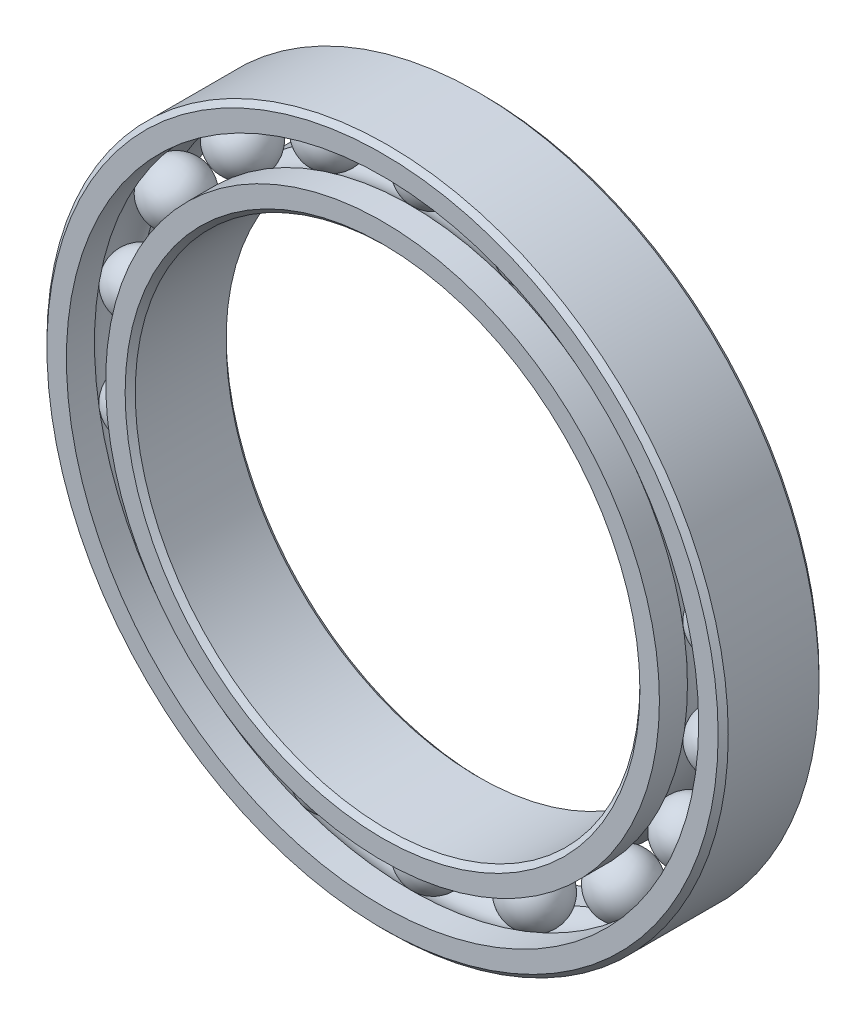
ISO-10303-21;
HEADER;
FILE_DESCRIPTION(('STEP AP214'),'2;1');
FILE_NAME('part.step','',(''),(''),'','','');
FILE_SCHEMA(('AUTOMOTIVE_DESIGN { 1 0 10303 214 1 1 1 1 }'));
ENDSEC;
DATA;
#1=APPLICATION_CONTEXT('core data for automotive mechanical design processes');
#2=APPLICATION_PROTOCOL_DEFINITION('international standard','automotive_design',2000,#1);
#3=PRODUCT_CONTEXT('',#1,'mechanical');
#4=PRODUCT('Part','Part','',(#3));
#5=PRODUCT_RELATED_PRODUCT_CATEGORY('part','',(#4));
#6=PRODUCT_DEFINITION_FORMATION('','',#4);
#7=PRODUCT_DEFINITION_CONTEXT('part definition',#1,'design');
#8=PRODUCT_DEFINITION('design','',#6,#7);
#9=PRODUCT_DEFINITION_SHAPE('','',#8);
#10=(LENGTH_UNIT() NAMED_UNIT(*) SI_UNIT(.MILLI.,.METRE.));
#11=(NAMED_UNIT(*) PLANE_ANGLE_UNIT() SI_UNIT($,.RADIAN.));
#12=(NAMED_UNIT(*) SI_UNIT($,.STERADIAN.) SOLID_ANGLE_UNIT());
#13=UNCERTAINTY_MEASURE_WITH_UNIT(LENGTH_MEASURE(1.E-05),#10,'distance_accuracy_value','');
#14=(GEOMETRIC_REPRESENTATION_CONTEXT(3) GLOBAL_UNCERTAINTY_ASSIGNED_CONTEXT((#13)) GLOBAL_UNIT_ASSIGNED_CONTEXT((#10,
#11,#12)) REPRESENTATION_CONTEXT('',''));
#15=CARTESIAN_POINT('',(0.,0.,0.));
#16=DIRECTION('',(0.,0.,1.));
#17=DIRECTION('',(1.,0.,0.));
#18=AXIS2_PLACEMENT_3D('',#15,#16,#17);
#19=CARTESIAN_POINT('',(4.01873668407647,11.0413882942345,0.));
#20=DIRECTION('',(0.,0.,1.));
#21=DIRECTION('',(0.342020143325657,0.939692620785913,0.));
#22=AXIS2_PLACEMENT_3D('',#19,#20,#21);
#23=SPHERICAL_SURFACE('',#22,1.18112731252607);
#24=CARTESIAN_POINT('',(4.01873668407647,11.0413882942345,1.18112731252607));
#25=VERTEX_POINT('',#24);
#26=VERTEX_LOOP('',#25);
#27=FACE_BOUND('',#26,.T.);
#28=ADVANCED_FACE('F37',(#27),#23,.T.);
#29=CLOSED_SHELL('',(#28));
#30=MANIFOLD_SOLID_BREP('B2',#29);
#31=CARTESIAN_POINT('',(7.55275441381673,9.00102220664808,0.));
#32=DIRECTION('',(0.,0.,1.));
#33=DIRECTION('',(0.64278760968653,0.766044443118986,0.));
#34=AXIS2_PLACEMENT_3D('',#31,#32,#33);
#35=SPHERICAL_SURFACE('',#34,1.18112731252607);
#36=CARTESIAN_POINT('',(7.55275441381673,9.00102220664808,1.18112731252607));
#37=VERTEX_POINT('',#36);
#38=VERTEX_LOOP('',#37);
#39=FACE_BOUND('',#38,.T.);
#40=ADVANCED_FACE('F57',(#39),#35,.T.);
#41=CLOSED_SHELL('',(#40));
#42=MANIFOLD_SOLID_BREP('B6',#41);
#43=CARTESIAN_POINT('',(10.1757984944671,5.87500000000012,0.));
#44=DIRECTION('',(0.,0.,1.));
#45=DIRECTION('',(0.866025403784433,0.50000000000001,0.));
#46=AXIS2_PLACEMENT_3D('',#43,#44,#45);
#47=SPHERICAL_SURFACE('',#46,1.18112731252607);
#48=CARTESIAN_POINT('',(10.1757984944671,5.87500000000012,1.18112731252607));
#49=VERTEX_POINT('',#48);
#50=VERTEX_LOOP('',#49);
#51=FACE_BOUND('',#50,.T.);
#52=ADVANCED_FACE('F77',(#51),#47,.T.);
#53=CLOSED_SHELL('',(#52));
#54=MANIFOLD_SOLID_BREP('B33',#53);
#55=CARTESIAN_POINT('',(11.5714910978934,2.04036608758655,0.));
#56=DIRECTION('',(0.,0.,1.));
#57=DIRECTION('',(0.984807753012206,0.17364817766694,0.));
#58=AXIS2_PLACEMENT_3D('',#55,#56,#57);
#59=SPHERICAL_SURFACE('',#58,1.18112731252607);
#60=CARTESIAN_POINT('',(11.5714910978934,2.04036608758655,1.18112731252607));
#61=VERTEX_POINT('',#60);
#62=VERTEX_LOOP('',#61);
#63=FACE_BOUND('',#62,.T.);
#64=ADVANCED_FACE('F97',(#63),#59,.T.);
#65=CLOSED_SHELL('',(#64));
#66=MANIFOLD_SOLID_BREP('B53',#65);
#67=CARTESIAN_POINT('',(11.5714910978935,-2.04036608758632,0.));
#68=DIRECTION('',(0.,0.,1.));
#69=DIRECTION('',(0.98480775301221,-0.173648177666921,0.));
#70=AXIS2_PLACEMENT_3D('',#67,#68,#69);
#71=SPHERICAL_SURFACE('',#70,1.18112731252607);
#72=CARTESIAN_POINT('',(11.5714910978935,-2.04036608758632,1.18112731252607));
#73=VERTEX_POINT('',#72);
#74=VERTEX_LOOP('',#73);
#75=FACE_BOUND('',#74,.T.);
#76=ADVANCED_FACE('F117',(#75),#71,.T.);
#77=CLOSED_SHELL('',(#76));
#78=MANIFOLD_SOLID_BREP('B73',#77);
#79=CARTESIAN_POINT('',(10.1757984944672,-5.87499999999991,0.));
#80=DIRECTION('',(0.,0.,1.));
#81=DIRECTION('',(0.866025403784443,-0.499999999999992,0.));
#82=AXIS2_PLACEMENT_3D('',#79,#80,#81);
#83=SPHERICAL_SURFACE('',#82,1.18112731252607);
#84=CARTESIAN_POINT('',(10.1757984944672,-5.87499999999991,1.18112731252607));
#85=VERTEX_POINT('',#84);
#86=VERTEX_LOOP('',#85);
#87=FACE_BOUND('',#86,.T.);
#88=ADVANCED_FACE('F137',(#87),#83,.T.);
#89=CLOSED_SHELL('',(#88));
#90=MANIFOLD_SOLID_BREP('B93',#89);
#91=CARTESIAN_POINT('',(7.55275441381691,-9.00102220664793,0.));
#92=DIRECTION('',(0.,0.,1.));
#93=DIRECTION('',(0.642787609686546,-0.766044443118973,0.));
#94=AXIS2_PLACEMENT_3D('',#91,#92,#93);
#95=SPHERICAL_SURFACE('',#94,1.18112731252607);
#96=CARTESIAN_POINT('',(7.55275441381691,-9.00102220664793,1.18112731252607));
#97=VERTEX_POINT('',#96);
#98=VERTEX_LOOP('',#97);
#99=FACE_BOUND('',#98,.T.);
#100=ADVANCED_FACE('F157',(#99),#95,.T.);
#101=CLOSED_SHELL('',(#100));
#102=MANIFOLD_SOLID_BREP('B113',#101);
#103=CARTESIAN_POINT('',(4.01873668407669,-11.0413882942344,0.));
#104=DIRECTION('',(0.,0.,1.));
#105=DIRECTION('',(0.342020143325676,-0.939692620785906,0.));
#106=AXIS2_PLACEMENT_3D('',#103,#104,#105);
#107=SPHERICAL_SURFACE('',#106,1.18112731252607);
#108=CARTESIAN_POINT('',(4.01873668407669,-11.0413882942344,1.18112731252607));
#109=VERTEX_POINT('',#108);
#110=VERTEX_LOOP('',#109);
#111=FACE_BOUND('',#110,.T.);
#112=ADVANCED_FACE('F177',(#111),#107,.T.);
#113=CLOSED_SHELL('',(#112));
#114=MANIFOLD_SOLID_BREP('B133',#113);
#115=CARTESIAN_POINT('',(0.,-11.75,0.));
#116=DIRECTION('',(0.,0.,1.));
#117=DIRECTION('',(0.,-1.,0.));
#118=AXIS2_PLACEMENT_3D('',#115,#116,#117);
#119=SPHERICAL_SURFACE('',#118,1.18112731252607);
#120=CARTESIAN_POINT('',(0.,-11.75,1.18112731252607));
#121=VERTEX_POINT('',#120);
#122=VERTEX_LOOP('',#121);
#123=FACE_BOUND('',#122,.T.);
#124=ADVANCED_FACE('F197',(#123),#119,.T.);
#125=CLOSED_SHELL('',(#124));
#126=MANIFOLD_SOLID_BREP('B153',#125);
#127=CARTESIAN_POINT('',(-4.01873668407654,-11.0413882942344,0.));
#128=DIRECTION('',(0.,0.,1.));
#129=DIRECTION('',(-0.342020143325663,-0.939692620785911,0.));
#130=AXIS2_PLACEMENT_3D('',#127,#128,#129);
#131=SPHERICAL_SURFACE('',#130,1.18112731252607);
#132=CARTESIAN_POINT('',(-4.01873668407654,-11.0413882942344,1.18112731252607));
#133=VERTEX_POINT('',#132);
#134=VERTEX_LOOP('',#133);
#135=FACE_BOUND('',#134,.T.);
#136=ADVANCED_FACE('F217',(#135),#131,.T.);
#137=CLOSED_SHELL('',(#136));
#138=MANIFOLD_SOLID_BREP('B173',#137);
#139=CARTESIAN_POINT('',(-7.55275441381679,-9.00102220664803,0.));
#140=DIRECTION('',(0.,0.,1.));
#141=DIRECTION('',(-0.642787609686535,-0.766044443118981,0.));
#142=AXIS2_PLACEMENT_3D('',#139,#140,#141);
#143=SPHERICAL_SURFACE('',#142,1.18112731252607);
#144=CARTESIAN_POINT('',(-7.55275441381679,-9.00102220664803,1.18112731252607));
#145=VERTEX_POINT('',#144);
#146=VERTEX_LOOP('',#145);
#147=FACE_BOUND('',#146,.T.);
#148=ADVANCED_FACE('F237',(#147),#143,.T.);
#149=CLOSED_SHELL('',(#148));
#150=MANIFOLD_SOLID_BREP('B193',#149);
#151=CARTESIAN_POINT('',(-10.1757984944671,-5.87500000000005,0.));
#152=DIRECTION('',(0.,0.,1.));
#153=DIRECTION('',(-0.866025403784436,-0.500000000000004,0.));
#154=AXIS2_PLACEMENT_3D('',#151,#152,#153);
#155=SPHERICAL_SURFACE('',#154,1.18112731252607);
#156=CARTESIAN_POINT('',(-10.1757984944671,-5.87500000000005,1.18112731252607));
#157=VERTEX_POINT('',#156);
#158=VERTEX_LOOP('',#157);
#159=FACE_BOUND('',#158,.T.);
#160=ADVANCED_FACE('F257',(#159),#155,.T.);
#161=CLOSED_SHELL('',(#160));
#162=MANIFOLD_SOLID_BREP('B213',#161);
#163=CARTESIAN_POINT('',(-11.5714910978934,-2.04036608758647,0.));
#164=DIRECTION('',(0.,0.,1.));
#165=DIRECTION('',(-0.984807753012207,-0.173648177666934,0.));
#166=AXIS2_PLACEMENT_3D('',#163,#164,#165);
#167=SPHERICAL_SURFACE('',#166,1.18112731252607);
#168=CARTESIAN_POINT('',(-11.5714910978934,-2.04036608758647,1.18112731252607));
#169=VERTEX_POINT('',#168);
#170=VERTEX_LOOP('',#169);
#171=FACE_BOUND('',#170,.T.);
#172=ADVANCED_FACE('F277',(#171),#167,.T.);
#173=CLOSED_SHELL('',(#172));
#174=MANIFOLD_SOLID_BREP('B233',#173);
#175=CARTESIAN_POINT('',(-11.5714910978934,2.0403660875864,0.));
#176=DIRECTION('',(0.,0.,1.));
#177=DIRECTION('',(-0.984807753012209,0.173648177666927,0.));
#178=AXIS2_PLACEMENT_3D('',#175,#176,#177);
#179=SPHERICAL_SURFACE('',#178,1.18112731252607);
#180=CARTESIAN_POINT('',(-11.5714910978934,2.0403660875864,1.18112731252607));
#181=VERTEX_POINT('',#180);
#182=VERTEX_LOOP('',#181);
#183=FACE_BOUND('',#182,.T.);
#184=ADVANCED_FACE('F297',(#183),#179,.T.);
#185=CLOSED_SHELL('',(#184));
#186=MANIFOLD_SOLID_BREP('B253',#185);
#187=CARTESIAN_POINT('',(-10.1757984944672,5.87499999999998,0.));
#188=DIRECTION('',(0.,0.,1.));
#189=DIRECTION('',(-0.86602540378444,0.499999999999998,0.));
#190=AXIS2_PLACEMENT_3D('',#187,#188,#189);
#191=SPHERICAL_SURFACE('',#190,1.18112731252607);
#192=CARTESIAN_POINT('',(-10.1757984944672,5.87499999999998,1.18112731252607));
#193=VERTEX_POINT('',#192);
#194=VERTEX_LOOP('',#193);
#195=FACE_BOUND('',#194,.T.);
#196=ADVANCED_FACE('F317',(#195),#191,.T.);
#197=CLOSED_SHELL('',(#196));
#198=MANIFOLD_SOLID_BREP('B273',#197);
#199=CARTESIAN_POINT('',(-7.55275441381685,9.00102220664798,0.));
#200=DIRECTION('',(0.,0.,1.));
#201=DIRECTION('',(-0.642787609686541,0.766044443118977,0.));
#202=AXIS2_PLACEMENT_3D('',#199,#200,#201);
#203=SPHERICAL_SURFACE('',#202,1.18112731252607);
#204=CARTESIAN_POINT('',(-7.55275441381685,9.00102220664798,1.18112731252607));
#205=VERTEX_POINT('',#204);
#206=VERTEX_LOOP('',#205);
#207=FACE_BOUND('',#206,.T.);
#208=ADVANCED_FACE('F337',(#207),#203,.T.);
#209=CLOSED_SHELL('',(#208));
#210=MANIFOLD_SOLID_BREP('B293',#209);
#211=CARTESIAN_POINT('',(-4.01873668407662,11.0413882942344,0.));
#212=DIRECTION('',(0.,0.,1.));
#213=DIRECTION('',(-0.342020143325669,0.939692620785908,0.));
#214=AXIS2_PLACEMENT_3D('',#211,#212,#213);
#215=SPHERICAL_SURFACE('',#214,1.18112731252607);
#216=CARTESIAN_POINT('',(-4.01873668407662,11.0413882942344,1.18112731252607));
#217=VERTEX_POINT('',#216);
#218=VERTEX_LOOP('',#217);
#219=FACE_BOUND('',#218,.T.);
#220=ADVANCED_FACE('F357',(#219),#215,.T.);
#221=CLOSED_SHELL('',(#220));
#222=MANIFOLD_SOLID_BREP('B313',#221);
#223=CARTESIAN_POINT('',(0.,11.75,0.));
#224=DIRECTION('',(0.,0.,1.));
#225=DIRECTION('',(0.,1.,0.));
#226=AXIS2_PLACEMENT_3D('',#223,#224,#225);
#227=SPHERICAL_SURFACE('',#226,1.18112731252607);
#228=CARTESIAN_POINT('',(0.,11.75,1.18112731252607));
#229=VERTEX_POINT('',#228);
#230=VERTEX_LOOP('',#229);
#231=FACE_BOUND('',#230,.T.);
#232=ADVANCED_FACE('F379',(#231),#227,.T.);
#233=CLOSED_SHELL('',(#232));
#234=MANIFOLD_SOLID_BREP('B333',#233);
#235=CARTESIAN_POINT('',(0.,10.9722222222222,2.));
#236=DIRECTION('',(0.,0.,-1.));
#237=DIRECTION('',(-1.,0.,0.));
#238=AXIS2_PLACEMENT_3D('',#235,#236,#237);
#239=PLANE('',#238);
#240=CARTESIAN_POINT('',(0.,0.,2.));
#241=DIRECTION('',(0.,0.,1.));
#242=DIRECTION('',(1.,0.,0.));
#243=AXIS2_PLACEMENT_3D('',#240,#241,#242);
#244=CIRCLE('',#243,10.2);
#245=CARTESIAN_POINT('',(10.2,0.,2.));
#246=VERTEX_POINT('',#245);
#247=EDGE_CURVE('E426',#246,#246,#244,.T.);
#248=ORIENTED_EDGE('',*,*,#247,.F.);
#249=EDGE_LOOP('',(#248));
#250=FACE_BOUND('',#249,.T.);
#251=CARTESIAN_POINT('',(0.,0.,2.));
#252=DIRECTION('',(0.,0.,1.));
#253=DIRECTION('',(1.,0.,0.));
#254=AXIS2_PLACEMENT_3D('',#251,#252,#253);
#255=CIRCLE('',#254,10.9722222222222);
#256=CARTESIAN_POINT('',(10.9722222222222,0.,2.));
#257=VERTEX_POINT('',#256);
#258=EDGE_CURVE('E378',#257,#257,#255,.T.);
#259=ORIENTED_EDGE('',*,*,#258,.T.);
#260=EDGE_LOOP('',(#259));
#261=FACE_BOUND('',#260,.T.);
#262=ADVANCED_FACE('F398',(#250,#261),#239,.F.);
#263=CARTESIAN_POINT('',(0.,0.,2.));
#264=DIRECTION('',(0.,0.,1.));
#265=DIRECTION('',(1.,0.,0.));
#266=AXIS2_PLACEMENT_3D('',#263,#264,#265);
#267=CYLINDRICAL_SURFACE('',#266,10.9722222222222);
#268=ORIENTED_EDGE('',*,*,#258,.F.);
#269=EDGE_LOOP('',(#268));
#270=FACE_BOUND('',#269,.T.);
#271=CARTESIAN_POINT('',(0.,0.,0.888888888888886));
#272=DIRECTION('',(0.,0.,1.));
#273=DIRECTION('',(1.,0.,0.));
#274=AXIS2_PLACEMENT_3D('',#271,#272,#273);
#275=CIRCLE('',#274,10.9722222222222);
#276=CARTESIAN_POINT('',(10.9722222222222,0.,0.888888888888886));
#277=VERTEX_POINT('',#276);
#278=EDGE_CURVE('E404',#277,#277,#275,.T.);
#279=ORIENTED_EDGE('',*,*,#278,.T.);
#280=EDGE_LOOP('',(#279));
#281=FACE_BOUND('',#280,.T.);
#282=ADVANCED_FACE('F433',(#270,#281),#267,.T.);
#283=CARTESIAN_POINT('',(0.,0.,0.));
#284=DIRECTION('',(0.,0.,1.));
#285=DIRECTION('',(1.,0.,0.));
#286=AXIS2_PLACEMENT_3D('',#283,#284,#285);
#287=TOROIDAL_SURFACE('',#286,11.75,1.18112731252607);
#288=ORIENTED_EDGE('',*,*,#278,.F.);
#289=EDGE_LOOP('',(#288));
#290=FACE_BOUND('',#289,.T.);
#291=CARTESIAN_POINT('',(0.,0.,-0.888888888888887));
#292=DIRECTION('',(0.,0.,1.));
#293=DIRECTION('',(1.,0.,0.));
#294=AXIS2_PLACEMENT_3D('',#291,#292,#293);
#295=CIRCLE('',#294,10.9722222222222);
#296=CARTESIAN_POINT('',(10.9722222222222,0.,-0.888888888888887));
#297=VERTEX_POINT('',#296);
#298=EDGE_CURVE('E408',#297,#297,#295,.T.);
#299=ORIENTED_EDGE('',*,*,#298,.T.);
#300=EDGE_LOOP('',(#299));
#301=FACE_BOUND('',#300,.T.);
#302=ADVANCED_FACE('F437',(#290,#301),#287,.F.);
#303=CARTESIAN_POINT('',(0.,0.,2.));
#304=DIRECTION('',(0.,0.,1.));
#305=DIRECTION('',(1.,0.,0.));
#306=AXIS2_PLACEMENT_3D('',#303,#304,#305);
#307=CYLINDRICAL_SURFACE('',#306,10.9722222222222);
#308=ORIENTED_EDGE('',*,*,#298,.F.);
#309=EDGE_LOOP('',(#308));
#310=FACE_BOUND('',#309,.T.);
#311=CARTESIAN_POINT('',(0.,0.,-2.));
#312=DIRECTION('',(0.,0.,1.));
#313=DIRECTION('',(1.,0.,0.));
#314=AXIS2_PLACEMENT_3D('',#311,#312,#313);
#315=CIRCLE('',#314,10.9722222222222);
#316=CARTESIAN_POINT('',(10.9722222222222,0.,-2.));
#317=VERTEX_POINT('',#316);
#318=EDGE_CURVE('E412',#317,#317,#315,.T.);
#319=ORIENTED_EDGE('',*,*,#318,.T.);
#320=EDGE_LOOP('',(#319));
#321=FACE_BOUND('',#320,.T.);
#322=ADVANCED_FACE('F442',(#310,#321),#307,.T.);
#323=CARTESIAN_POINT('',(0.,10.2,-2.00000000000001));
#324=DIRECTION('',(0.,0.,1.));
#325=DIRECTION('',(1.,0.,0.));
#326=AXIS2_PLACEMENT_3D('',#323,#324,#325);
#327=PLANE('',#326);
#328=ORIENTED_EDGE('',*,*,#318,.F.);
#329=EDGE_LOOP('',(#328));
#330=FACE_BOUND('',#329,.T.);
#331=CARTESIAN_POINT('',(0.,0.,-2.00000000000001));
#332=DIRECTION('',(0.,0.,1.));
#333=DIRECTION('',(1.,0.,0.));
#334=AXIS2_PLACEMENT_3D('',#331,#332,#333);
#335=CIRCLE('',#334,10.2);
#336=CARTESIAN_POINT('',(10.2,0.,-2.00000000000001));
#337=VERTEX_POINT('',#336);
#338=EDGE_CURVE('E417',#337,#337,#335,.T.);
#339=ORIENTED_EDGE('',*,*,#338,.T.);
#340=EDGE_LOOP('',(#339));
#341=FACE_BOUND('',#340,.T.);
#342=ADVANCED_FACE('F448',(#330,#341),#327,.F.);
#343=CARTESIAN_POINT('',(0.,0.,-1.80000000000001));
#344=DIRECTION('',(0.,0.,-1.));
#345=DIRECTION('',(-1.,0.,0.));
#346=AXIS2_PLACEMENT_3D('',#343,#344,#345);
#347=CONICAL_SURFACE('',#346,10.,0.785398163397445);
#348=ORIENTED_EDGE('',*,*,#338,.F.);
#349=EDGE_LOOP('',(#348));
#350=FACE_BOUND('',#349,.T.);
#351=CARTESIAN_POINT('',(0.,0.,-1.80000000000001));
#352=DIRECTION('',(0.,0.,1.));
#353=DIRECTION('',(1.,0.,0.));
#354=AXIS2_PLACEMENT_3D('',#351,#352,#353);
#355=CIRCLE('',#354,10.);
#356=CARTESIAN_POINT('',(10.,0.,-1.80000000000001));
#357=VERTEX_POINT('',#356);
#358=EDGE_CURVE('E420',#357,#357,#355,.T.);
#359=ORIENTED_EDGE('',*,*,#358,.T.);
#360=EDGE_LOOP('',(#359));
#361=FACE_BOUND('',#360,.T.);
#362=ADVANCED_FACE('F452',(#350,#361),#347,.F.);
#363=CARTESIAN_POINT('',(0.,0.,2.));
#364=DIRECTION('',(0.,0.,1.));
#365=DIRECTION('',(1.,0.,0.));
#366=AXIS2_PLACEMENT_3D('',#363,#364,#365);
#367=CYLINDRICAL_SURFACE('',#366,10.);
#368=ORIENTED_EDGE('',*,*,#358,.F.);
#369=EDGE_LOOP('',(#368));
#370=FACE_BOUND('',#369,.T.);
#371=CARTESIAN_POINT('',(0.,0.,1.80000000000001));
#372=DIRECTION('',(0.,0.,1.));
#373=DIRECTION('',(1.,0.,0.));
#374=AXIS2_PLACEMENT_3D('',#371,#372,#373);
#375=CIRCLE('',#374,10.);
#376=CARTESIAN_POINT('',(10.,0.,1.80000000000001));
#377=VERTEX_POINT('',#376);
#378=EDGE_CURVE('E423',#377,#377,#375,.T.);
#379=ORIENTED_EDGE('',*,*,#378,.T.);
#380=EDGE_LOOP('',(#379));
#381=FACE_BOUND('',#380,.T.);
#382=ADVANCED_FACE('F456',(#370,#381),#367,.F.);
#383=CARTESIAN_POINT('',(0.,0.,2.));
#384=DIRECTION('',(0.,0.,1.));
#385=DIRECTION('',(1.,0.,0.));
#386=AXIS2_PLACEMENT_3D('',#383,#384,#385);
#387=CONICAL_SURFACE('',#386,10.2,0.785398163397448);
#388=ORIENTED_EDGE('',*,*,#378,.F.);
#389=EDGE_LOOP('',(#388));
#390=FACE_BOUND('',#389,.T.);
#391=ORIENTED_EDGE('',*,*,#247,.T.);
#392=EDGE_LOOP('',(#391));
#393=FACE_BOUND('',#392,.T.);
#394=ADVANCED_FACE('F430',(#390,#393),#387,.F.);
#395=CLOSED_SHELL('',(#262,#282,#302,#322,#342,#362,#382,#394));
#396=MANIFOLD_SOLID_BREP('B353',#395);
#397=CARTESIAN_POINT('',(0.,0.,1.8));
#398=DIRECTION('',(0.,0.,-1.));
#399=DIRECTION('',(-1.,0.,0.));
#400=AXIS2_PLACEMENT_3D('',#397,#398,#399);
#401=CONICAL_SURFACE('',#400,13.5,0.785398163397444);
#402=CARTESIAN_POINT('',(0.,0.,2.));
#403=DIRECTION('',(0.,0.,1.));
#404=DIRECTION('',(1.,0.,0.));
#405=AXIS2_PLACEMENT_3D('',#402,#403,#404);
#406=CIRCLE('',#405,13.3);
#407=CARTESIAN_POINT('',(13.3,0.,2.));
#408=VERTEX_POINT('',#407);
#409=EDGE_CURVE('E547',#408,#408,#406,.T.);
#410=ORIENTED_EDGE('',*,*,#409,.F.);
#411=EDGE_LOOP('',(#410));
#412=FACE_BOUND('',#411,.T.);
#413=CARTESIAN_POINT('',(0.,0.,1.8));
#414=DIRECTION('',(0.,0.,1.));
#415=DIRECTION('',(1.,0.,0.));
#416=AXIS2_PLACEMENT_3D('',#413,#414,#415);
#417=CIRCLE('',#416,13.5);
#418=CARTESIAN_POINT('',(13.5,0.,1.8));
#419=VERTEX_POINT('',#418);
#420=EDGE_CURVE('E397',#419,#419,#417,.T.);
#421=ORIENTED_EDGE('',*,*,#420,.T.);
#422=EDGE_LOOP('',(#421));
#423=FACE_BOUND('',#422,.T.);
#424=ADVANCED_FACE('F519',(#412,#423),#401,.T.);
#425=CARTESIAN_POINT('',(0.,0.,2.));
#426=DIRECTION('',(0.,0.,1.));
#427=DIRECTION('',(1.,0.,0.));
#428=AXIS2_PLACEMENT_3D('',#425,#426,#427);
#429=CYLINDRICAL_SURFACE('',#428,13.5);
#430=ORIENTED_EDGE('',*,*,#420,.F.);
#431=EDGE_LOOP('',(#430));
#432=FACE_BOUND('',#431,.T.);
#433=CARTESIAN_POINT('',(0.,0.,-1.80000000000001));
#434=DIRECTION('',(0.,0.,1.));
#435=DIRECTION('',(1.,0.,0.));
#436=AXIS2_PLACEMENT_3D('',#433,#434,#435);
#437=CIRCLE('',#436,13.5);
#438=CARTESIAN_POINT('',(13.5,0.,-1.80000000000001));
#439=VERTEX_POINT('',#438);
#440=EDGE_CURVE('E525',#439,#439,#437,.T.);
#441=ORIENTED_EDGE('',*,*,#440,.T.);
#442=EDGE_LOOP('',(#441));
#443=FACE_BOUND('',#442,.T.);
#444=ADVANCED_FACE('F554',(#432,#443),#429,.T.);
#445=CARTESIAN_POINT('',(0.,0.,-2.00000000000001));
#446=DIRECTION('',(0.,0.,1.));
#447=DIRECTION('',(1.,0.,0.));
#448=AXIS2_PLACEMENT_3D('',#445,#446,#447);
#449=CONICAL_SURFACE('',#448,13.3,0.785398163397445);
#450=ORIENTED_EDGE('',*,*,#440,.F.);
#451=EDGE_LOOP('',(#450));
#452=FACE_BOUND('',#451,.T.);
#453=CARTESIAN_POINT('',(0.,0.,-2.00000000000001));
#454=DIRECTION('',(0.,0.,1.));
#455=DIRECTION('',(1.,0.,0.));
#456=AXIS2_PLACEMENT_3D('',#453,#454,#455);
#457=CIRCLE('',#456,13.3);
#458=CARTESIAN_POINT('',(13.3,0.,-2.00000000000001));
#459=VERTEX_POINT('',#458);
#460=EDGE_CURVE('E529',#459,#459,#457,.T.);
#461=ORIENTED_EDGE('',*,*,#460,.T.);
#462=EDGE_LOOP('',(#461));
#463=FACE_BOUND('',#462,.T.);
#464=ADVANCED_FACE('F558',(#452,#463),#449,.T.);
#465=CARTESIAN_POINT('',(0.,13.3,-2.00000000000001));
#466=DIRECTION('',(0.,0.,1.));
#467=DIRECTION('',(1.,0.,0.));
#468=AXIS2_PLACEMENT_3D('',#465,#466,#467);
#469=PLANE('',#468);
#470=ORIENTED_EDGE('',*,*,#460,.F.);
#471=EDGE_LOOP('',(#470));
#472=FACE_BOUND('',#471,.T.);
#473=CARTESIAN_POINT('',(0.,0.,-2.00000000000001));
#474=DIRECTION('',(0.,0.,1.));
#475=DIRECTION('',(1.,0.,0.));
#476=AXIS2_PLACEMENT_3D('',#473,#474,#475);
#477=CIRCLE('',#476,12.5277777777778);
#478=CARTESIAN_POINT('',(12.5277777777778,0.,-2.00000000000001));
#479=VERTEX_POINT('',#478);
#480=EDGE_CURVE('E533',#479,#479,#477,.T.);
#481=ORIENTED_EDGE('',*,*,#480,.T.);
#482=EDGE_LOOP('',(#481));
#483=FACE_BOUND('',#482,.T.);
#484=ADVANCED_FACE('F563',(#472,#483),#469,.F.);
#485=CARTESIAN_POINT('',(0.,0.,2.));
#486=DIRECTION('',(0.,0.,1.));
#487=DIRECTION('',(1.,0.,0.));
#488=AXIS2_PLACEMENT_3D('',#485,#486,#487);
#489=CYLINDRICAL_SURFACE('',#488,12.5277777777778);
#490=ORIENTED_EDGE('',*,*,#480,.F.);
#491=EDGE_LOOP('',(#490));
#492=FACE_BOUND('',#491,.T.);
#493=CARTESIAN_POINT('',(0.,0.,-0.888888888888893));
#494=DIRECTION('',(0.,0.,1.));
#495=DIRECTION('',(1.,0.,0.));
#496=AXIS2_PLACEMENT_3D('',#493,#494,#495);
#497=CIRCLE('',#496,12.5277777777778);
#498=CARTESIAN_POINT('',(12.5277777777778,0.,-0.888888888888893));
#499=VERTEX_POINT('',#498);
#500=EDGE_CURVE('E538',#499,#499,#497,.T.);
#501=ORIENTED_EDGE('',*,*,#500,.T.);
#502=EDGE_LOOP('',(#501));
#503=FACE_BOUND('',#502,.T.);
#504=ADVANCED_FACE('F569',(#492,#503),#489,.F.);
#505=CARTESIAN_POINT('',(0.,0.,0.));
#506=DIRECTION('',(0.,0.,1.));
#507=DIRECTION('',(1.,0.,0.));
#508=AXIS2_PLACEMENT_3D('',#505,#506,#507);
#509=TOROIDAL_SURFACE('',#508,11.75,1.18112731252607);
#510=ORIENTED_EDGE('',*,*,#500,.F.);
#511=EDGE_LOOP('',(#510));
#512=FACE_BOUND('',#511,.T.);
#513=CARTESIAN_POINT('',(0.,0.,0.888888888888886));
#514=DIRECTION('',(0.,0.,1.));
#515=DIRECTION('',(1.,0.,0.));
#516=AXIS2_PLACEMENT_3D('',#513,#514,#515);
#517=CIRCLE('',#516,12.5277777777778);
#518=CARTESIAN_POINT('',(12.5277777777778,0.,0.888888888888886));
#519=VERTEX_POINT('',#518);
#520=EDGE_CURVE('E541',#519,#519,#517,.T.);
#521=ORIENTED_EDGE('',*,*,#520,.T.);
#522=EDGE_LOOP('',(#521));
#523=FACE_BOUND('',#522,.T.);
#524=ADVANCED_FACE('F573',(#512,#523),#509,.F.);
#525=CARTESIAN_POINT('',(0.,0.,2.));
#526=DIRECTION('',(0.,0.,1.));
#527=DIRECTION('',(1.,0.,0.));
#528=AXIS2_PLACEMENT_3D('',#525,#526,#527);
#529=CYLINDRICAL_SURFACE('',#528,12.5277777777778);
#530=ORIENTED_EDGE('',*,*,#520,.F.);
#531=EDGE_LOOP('',(#530));
#532=FACE_BOUND('',#531,.T.);
#533=CARTESIAN_POINT('',(0.,0.,2.));
#534=DIRECTION('',(0.,0.,1.));
#535=DIRECTION('',(1.,0.,0.));
#536=AXIS2_PLACEMENT_3D('',#533,#534,#535);
#537=CIRCLE('',#536,12.5277777777778);
#538=CARTESIAN_POINT('',(12.5277777777778,0.,2.));
#539=VERTEX_POINT('',#538);
#540=EDGE_CURVE('E544',#539,#539,#537,.T.);
#541=ORIENTED_EDGE('',*,*,#540,.T.);
#542=EDGE_LOOP('',(#541));
#543=FACE_BOUND('',#542,.T.);
#544=ADVANCED_FACE('F577',(#532,#543),#529,.F.);
#545=CARTESIAN_POINT('',(0.,13.3,2.));
#546=DIRECTION('',(0.,0.,-1.));
#547=DIRECTION('',(-1.,0.,0.));
#548=AXIS2_PLACEMENT_3D('',#545,#546,#547);
#549=PLANE('',#548);
#550=ORIENTED_EDGE('',*,*,#540,.F.);
#551=EDGE_LOOP('',(#550));
#552=FACE_BOUND('',#551,.T.);
#553=ORIENTED_EDGE('',*,*,#409,.T.);
#554=EDGE_LOOP('',(#553));
#555=FACE_BOUND('',#554,.T.);
#556=ADVANCED_FACE('F551',(#552,#555),#549,.F.);
#557=CLOSED_SHELL('',(#424,#444,#464,#484,#504,#524,#544,#556));
#558=MANIFOLD_SOLID_BREP('B373',#557);
#559=ADVANCED_BREP_SHAPE_REPRESENTATION('',(#18,#30,#42,#54,#66,#78,#90,#102,#114,#126,#138,
#150,#162,#174,#186,#198,#210,#222,#234,#396,#558),#14);
#560=SHAPE_DEFINITION_REPRESENTATION(#9,#559);
ENDSEC;
END-ISO-10303-21;
